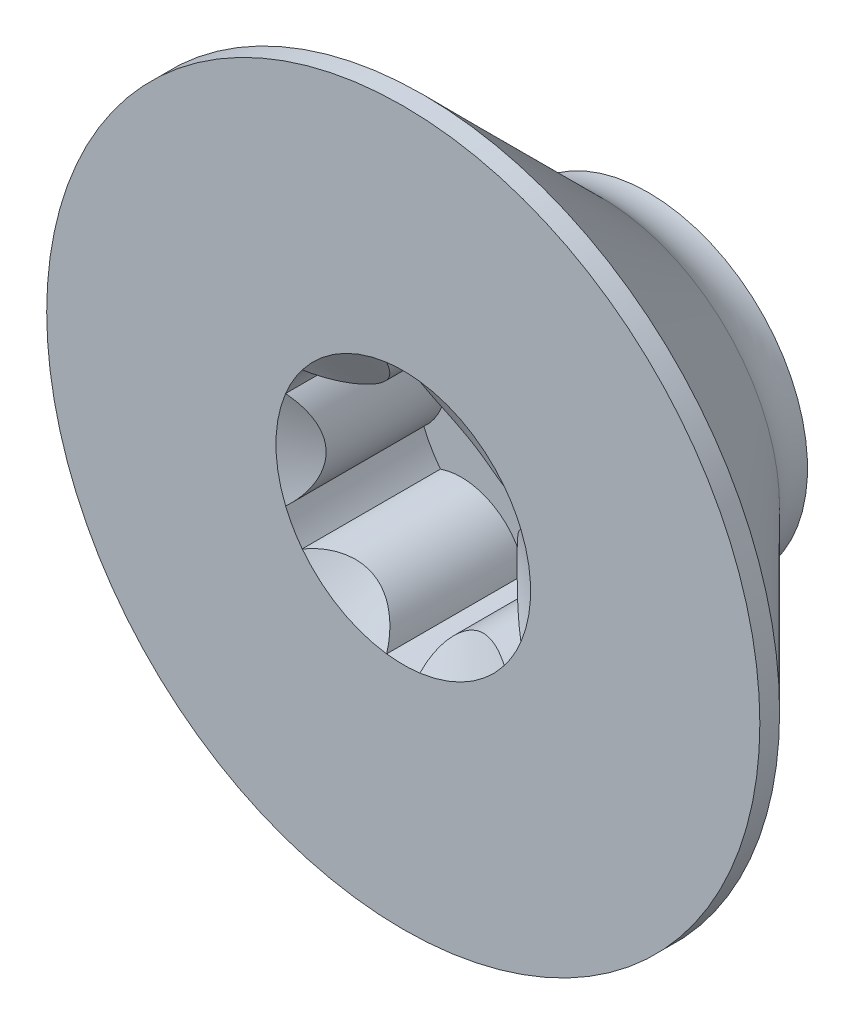
ISO-10303-21;
HEADER;
FILE_DESCRIPTION(('STEP AP214'),'2;1');
FILE_NAME('part.step','',(''),(''),'','','');
FILE_SCHEMA(('AUTOMOTIVE_DESIGN { 1 0 10303 214 1 1 1 1 }'));
ENDSEC;
DATA;
#1=APPLICATION_CONTEXT('core data for automotive mechanical design processes');
#2=APPLICATION_PROTOCOL_DEFINITION('international standard','automotive_design',2000,#1);
#3=PRODUCT_CONTEXT('',#1,'mechanical');
#4=PRODUCT('Part','Part','',(#3));
#5=PRODUCT_RELATED_PRODUCT_CATEGORY('part','',(#4));
#6=PRODUCT_DEFINITION_FORMATION('','',#4);
#7=PRODUCT_DEFINITION_CONTEXT('part definition',#1,'design');
#8=PRODUCT_DEFINITION('design','',#6,#7);
#9=PRODUCT_DEFINITION_SHAPE('','',#8);
#10=(LENGTH_UNIT() NAMED_UNIT(*) SI_UNIT(.MILLI.,.METRE.));
#11=(NAMED_UNIT(*) PLANE_ANGLE_UNIT() SI_UNIT($,.RADIAN.));
#12=(NAMED_UNIT(*) SI_UNIT($,.STERADIAN.) SOLID_ANGLE_UNIT());
#13=UNCERTAINTY_MEASURE_WITH_UNIT(LENGTH_MEASURE(1.E-05),#10,'distance_accuracy_value','');
#14=(GEOMETRIC_REPRESENTATION_CONTEXT(3) GLOBAL_UNCERTAINTY_ASSIGNED_CONTEXT((#13)) GLOBAL_UNIT_ASSIGNED_CONTEXT((#10,
#11,#12)) REPRESENTATION_CONTEXT('',''));
#15=CARTESIAN_POINT('',(0.,0.,0.));
#16=DIRECTION('',(0.,0.,1.));
#17=DIRECTION('',(1.,0.,0.));
#18=AXIS2_PLACEMENT_3D('',#15,#16,#17);
#19=CARTESIAN_POINT('',(0.,0.,-5.6843418860808E-11));
#20=DIRECTION('',(0.,0.,1.));
#21=DIRECTION('',(1.,0.,0.));
#22=AXIS2_PLACEMENT_3D('',#19,#20,#21);
#23=CONICAL_SURFACE('',#22,1.99999999989586,1.0471975512089);
#24=CARTESIAN_POINT('',(-1.84775906502267,0.765366864730291,3.35881149449636E-12));
#25=CARTESIAN_POINT('',(-1.82679674641308,0.747056027473375,-0.0152238683224688));
#26=CARTESIAN_POINT('',(-1.80651528336189,0.727831960891158,-0.0302588823249752));
#27=CARTESIAN_POINT('',(-1.76740513351053,0.687540802662732,-0.0598189343843815));
#28=CARTESIAN_POINT('',(-1.74857824004046,0.666471502192737,-0.0743433312559914));
#29=CARTESIAN_POINT('',(-1.69418339623,0.600166604567393,-0.117138232672408));
#30=CARTESIAN_POINT('',(-1.66106296120929,0.552146254879396,-0.144365576121972));
#31=CARTESIAN_POINT('',(-1.6090468471527,0.460298780203178,-0.188626206330927));
#32=CARTESIAN_POINT('',(-1.58862383693925,0.41778220122538,-0.206593330210003));
#33=CARTESIAN_POINT('',(-1.55356856955068,0.329020197426314,-0.238128431972136));
#34=CARTESIAN_POINT('',(-1.53891426005207,0.282789802535261,-0.251713126116636));
#35=CARTESIAN_POINT('',(-1.51800768029137,0.194886276103911,-0.271360848688806));
#36=CARTESIAN_POINT('',(-1.51079927575463,0.153632562684492,-0.278268411323695));
#37=CARTESIAN_POINT('',(-1.50154462512118,0.070015972232407,-0.287168365717986));
#38=CARTESIAN_POINT('',(-1.49949648381577,0.027653508187644,-0.289162562002376));
#39=CARTESIAN_POINT('',(-1.50071460979296,-0.0569440107304732,-0.287983285466117));
#40=CARTESIAN_POINT('',(-1.50398395531869,-0.0991789776152245,-0.284806819396777));
#41=CARTESIAN_POINT('',(-1.51560246229933,-0.182288930425316,-0.273677706531455));
#42=CARTESIAN_POINT('',(-1.52395466268178,-0.223163087320971,-0.265722202490104));
#43=CARTESIAN_POINT('',(-1.54780627502721,-0.312201623236177,-0.243470771410179));
#44=CARTESIAN_POINT('',(-1.56453858574171,-0.359766576056661,-0.228112461167358));
#45=CARTESIAN_POINT('',(-1.60405661038,-0.450678167653208,-0.193007553579758));
#46=CARTESIAN_POINT('',(-1.62686341488875,-0.494009376342824,-0.173245707024587));
#47=CARTESIAN_POINT('',(-1.67962174633487,-0.579196712824482,-0.129117003203694));
#48=CARTESIAN_POINT('',(-1.70999546714635,-0.620665648629647,-0.104509642724714));
#49=CARTESIAN_POINT('',(-1.75918337244193,-0.678361341469527,-0.0661604495560057));
#50=CARTESIAN_POINT('',(-1.7761075592942,-0.696775868251633,-0.053193487779679));
#51=CARTESIAN_POINT('',(-1.81109638947949,-0.732156016067272,-0.026866991625521));
#52=CARTESIAN_POINT('',(-1.82916025928735,-0.749122601832335,-0.0135077267344029));
#53=CARTESIAN_POINT('',(-1.84775906502267,-0.765366864730291,3.35843881634344E-12));
#54=B_SPLINE_CURVE_WITH_KNOTS('',3,(#24,#25,#26,#27,#28,#29,#30,#31,#32,#33,#34,#35,#36,#37,#38,
#39,#40,#41,#42,#43,#44,#45,#46,#47,#48,#49,#50,#51,#52,#53),.UNSPECIFIED.,.F.,.F.,(4,2,2,2,2,2,
2,2,2,2,2,2,2,2,4),(0.,0.0951229900385469,0.190361444756559,0.382460595296424,0.53334787054542,
0.683652605425383,0.810429442598182,0.937159711679269,1.06396336983624,1.19084291570532,
1.34811922291334,1.50594887578386,1.6762514428505,1.76071621820737,1.84512426985371),.UNSPECIFIED.);
#55=CARTESIAN_POINT('',(-1.84775906502636,0.765366864733511,4.39685374961005E-12));
#56=VERTEX_POINT('',#55);
#57=CARTESIAN_POINT('',(-1.84775906502636,-0.765366864733509,4.39685374961005E-12));
#58=VERTEX_POINT('',#57);
#59=EDGE_CURVE('E129',#56,#58,#54,.T.);
#60=ORIENTED_EDGE('',*,*,#59,.F.);
#61=CARTESIAN_POINT('',(0.,0.,8.7937074992201E-12));
#62=DIRECTION('',(0.,0.,1.));
#63=DIRECTION('',(1.,0.,0.));
#64=AXIS2_PLACEMENT_3D('',#61,#62,#63);
#65=CIRCLE('',#64,2.00000000000955);
#66=EDGE_CURVE('E20',#58,#56,#65,.F.);
#67=ORIENTED_EDGE('',*,*,#66,.F.);
#68=EDGE_LOOP('',(#60,#67));
#69=FACE_BOUND('',#68,.T.);
#70=ADVANCED_FACE('F16',(#69),#23,.F.);
#71=CARTESIAN_POINT('',(0.,0.,-5.6843418860808E-11));
#72=DIRECTION('',(0.,0.,1.));
#73=DIRECTION('',(1.,0.,0.));
#74=AXIS2_PLACEMENT_3D('',#71,#72,#73);
#75=CONICAL_SURFACE('',#74,1.99999999989586,1.0471975512089);
#76=CARTESIAN_POINT('',(-0.261052384440077,1.98288972274776,3.35771034073655E-12));
#77=CARTESIAN_POINT('',(-0.266428875364333,1.95558040368117,-0.0152238683224701));
#78=CARTESIAN_POINT('',(-0.272936673862979,1.92840410816181,-0.0302588823249764));
#79=CARTESIAN_POINT('',(-0.288274765511015,1.87438814573051,-0.0598189343843826));
#80=CARTESIAN_POINT('',(-0.297107868222961,1.84754892747608,-0.0743433312559924));
#81=CARTESIAN_POINT('',(-0.327332172056604,1.76728916208867,-0.117138232672409));
#82=CARTESIAN_POINT('',(-0.352358797274669,1.71459584913235,-0.144365576121973));
#83=CARTESIAN_POINT('',(-0.405892986589424,1.62362483561508,-0.188626206330928));
#84=CARTESIAN_POINT('',(-0.432501918959478,1.58467970045958,-0.206593330210004));
#85=CARTESIAN_POINT('',(-0.491844435445998,1.50993994646509,-0.238128431972137));
#86=CARTESIAN_POINT('',(-0.524553977099328,1.47413374471885,-0.251713126116637));
#87=CARTESIAN_POINT('',(-0.590227374190765,1.41207635232416,-0.271360848688806));
#88=CARTESIAN_POINT('',(-0.622349935744055,1.38520683416488,-0.278268411323696));
#89=CARTESIAN_POINT('',(-0.690136701936673,1.33538377638712,-0.287168365717987));
#90=CARTESIAN_POINT('',(-0.725799601313637,1.31242880196371,-0.289162562002376));
#91=CARTESIAN_POINT('',(-0.799672264782456,1.27118497054591,-0.287983285466118));
#92=CARTESIAN_POINT('',(-0.837883491795509,1.25289882338256,-0.284806819396778));
#93=CARTESIAN_POINT('',(-0.915668075726695,1.2214057691768,-0.273677706531455));
#94=CARTESIAN_POINT('',(-0.955242234147826,1.20820190843767,-0.265722202490105));
#95=CARTESIAN_POINT('',(-1.04427767433889,1.18433874269243,-0.24347077141018));
#96=CARTESIAN_POINT('',(-1.09383628716848,1.17504687242496,-0.228112461167358));
#97=CARTESIAN_POINT('',(-1.19232704730871,1.16381468987083,-0.193007553579758));
#98=CARTESIAN_POINT('',(-1.24125637706498,1.16190035760973,-0.173245707024587));
#99=CARTESIAN_POINT('',(-1.34140994026189,1.16499674466252,-0.129117003203695));
#100=CARTESIAN_POINT('',(-1.3925099525428,1.17056669059014,-0.104509642724715));
#101=CARTESIAN_POINT('',(-1.46706984087887,1.18431681971511,-0.0661604495560069));
#102=CARTESIAN_POINT('',(-1.49147938229698,1.18976633207652,-0.0531934877796802));
#103=CARTESIAN_POINT('',(-1.53961390418762,1.20237747395786,-0.0268669916255223));
#104=CARTESIAN_POINT('',(-1.56333933337958,1.20953795121959,-0.0135077267344044));
#105=CARTESIAN_POINT('',(-1.58670668058263,1.21752285801746,3.35688077097752E-12));
#106=B_SPLINE_CURVE_WITH_KNOTS('',3,(#76,#77,#78,#79,#80,#81,#82,#83,#84,#85,#86,#87,#88,#89,
#90,#91,#92,#93,#94,#95,#96,#97,#98,#99,#100,#101,#102,#103,#104,#105),.UNSPECIFIED.,.F.,.F.,(4,
2,2,2,2,2,2,2,2,2,2,2,2,2,4),(0.,0.0951229900385467,0.190361444756558,0.382460595296423,
0.533347870545419,0.683652605425383,0.810429442598181,0.937159711679268,1.06396336983623,
1.19084291570532,1.34811922291333,1.50594887578386,1.67625144285049,1.76071621820737,
1.84512426985371),.UNSPECIFIED.);
#107=CARTESIAN_POINT('',(-0.261052384439132,1.98288972275256,4.39672855672683E-12));
#108=VERTEX_POINT('',#107);
#109=CARTESIAN_POINT('',(-1.58670668058726,1.21752285801904,4.39672855672683E-12));
#110=VERTEX_POINT('',#109);
#111=EDGE_CURVE('E244',#108,#110,#106,.T.);
#112=ORIENTED_EDGE('',*,*,#111,.F.);
#113=CARTESIAN_POINT('',(0.,0.,8.79345711345365E-12));
#114=DIRECTION('',(0.,0.,1.));
#115=DIRECTION('',(1.,0.,0.));
#116=AXIS2_PLACEMENT_3D('',#113,#114,#115);
#117=CIRCLE('',#116,2.00000000000955);
#118=EDGE_CURVE('E114',#110,#108,#117,.F.);
#119=ORIENTED_EDGE('',*,*,#118,.F.);
#120=EDGE_LOOP('',(#112,#119));
#121=FACE_BOUND('',#120,.T.);
#122=ADVANCED_FACE('F289',(#121),#75,.F.);
#123=CARTESIAN_POINT('',(0.,0.,-2.17));
#124=DIRECTION('',(0.,0.,1.));
#125=DIRECTION('',(1.,0.,0.));
#126=AXIS2_PLACEMENT_3D('',#123,#124,#125);
#127=CYLINDRICAL_SURFACE('',#126,2.);
#128=DIRECTION('',(0.,0.,1.));
#129=VECTOR('',#128,1.);
#130=CARTESIAN_POINT('',(-1.84775906502257,0.765366864730198,-2.17));
#131=LINE('',#130,#129);
#132=CARTESIAN_POINT('',(-1.84775906502257,0.765366864730197,-2.17));
#133=VERTEX_POINT('',#132);
#134=EDGE_CURVE('E120',#133,#56,#131,.T.);
#135=ORIENTED_EDGE('',*,*,#134,.F.);
#136=CARTESIAN_POINT('',(0.,0.,-2.17));
#137=DIRECTION('',(0.,0.,1.));
#138=DIRECTION('',(1.,0.,0.));
#139=AXIS2_PLACEMENT_3D('',#136,#137,#138);
#140=CIRCLE('',#139,2.);
#141=CARTESIAN_POINT('',(-1.58670668058249,1.21752285801741,-2.17));
#142=VERTEX_POINT('',#141);
#143=EDGE_CURVE('E126',#142,#133,#140,.T.);
#144=ORIENTED_EDGE('',*,*,#143,.F.);
#145=DIRECTION('',(0.,0.,1.));
#146=VECTOR('',#145,1.);
#147=CARTESIAN_POINT('',(-1.58670668058249,1.21752285801741,-2.17));
#148=LINE('',#147,#146);
#149=EDGE_CURVE('E123',#110,#142,#148,.F.);
#150=ORIENTED_EDGE('',*,*,#149,.F.);
#151=CARTESIAN_POINT('',(0.,0.,0.));
#152=DIRECTION('',(0.,0.,1.));
#153=DIRECTION('',(1.,0.,0.));
#154=AXIS2_PLACEMENT_3D('',#151,#152,#153);
#155=CIRCLE('',#154,2.);
#156=EDGE_CURVE('E109',#56,#110,#155,.F.);
#157=ORIENTED_EDGE('',*,*,#156,.F.);
#158=EDGE_LOOP('',(#135,#144,#150,#157));
#159=FACE_BOUND('',#158,.T.);
#160=ADVANCED_FACE('F118',(#159),#127,.F.);
#161=CARTESIAN_POINT('',(0.,0.,-2.17));
#162=DIRECTION('',(0.,0.,1.));
#163=DIRECTION('',(1.,0.,0.));
#164=AXIS2_PLACEMENT_3D('',#161,#162,#163);
#165=CYLINDRICAL_SURFACE('',#164,2.);
#166=DIRECTION('',(0.,0.,1.));
#167=VECTOR('',#166,1.);
#168=CARTESIAN_POINT('',(-1.58670668058248,-1.21752285801743,-2.17));
#169=LINE('',#168,#167);
#170=CARTESIAN_POINT('',(-1.58670668058248,-1.21752285801743,-2.17));
#171=VERTEX_POINT('',#170);
#172=CARTESIAN_POINT('',(-1.58670668058725,-1.21752285801906,4.39685374961005E-12));
#173=VERTEX_POINT('',#172);
#174=EDGE_CURVE('E243',#171,#173,#169,.T.);
#175=ORIENTED_EDGE('',*,*,#174,.F.);
#176=CARTESIAN_POINT('',(0.,0.,-2.17));
#177=DIRECTION('',(0.,0.,1.));
#178=DIRECTION('',(1.,0.,0.));
#179=AXIS2_PLACEMENT_3D('',#176,#177,#178);
#180=CIRCLE('',#179,2.);
#181=CARTESIAN_POINT('',(-1.84775906502257,-0.765366864730197,-2.17));
#182=VERTEX_POINT('',#181);
#183=EDGE_CURVE('E125',#182,#171,#180,.T.);
#184=ORIENTED_EDGE('',*,*,#183,.F.);
#185=DIRECTION('',(0.,0.,1.));
#186=VECTOR('',#185,1.);
#187=CARTESIAN_POINT('',(-1.84775906502257,-0.765366864730197,-2.17));
#188=LINE('',#187,#186);
#189=EDGE_CURVE('E132',#58,#182,#188,.F.);
#190=ORIENTED_EDGE('',*,*,#189,.F.);
#191=CARTESIAN_POINT('',(0.,0.,0.));
#192=DIRECTION('',(0.,0.,1.));
#193=DIRECTION('',(1.,0.,0.));
#194=AXIS2_PLACEMENT_3D('',#191,#192,#193);
#195=CIRCLE('',#194,2.);
#196=EDGE_CURVE('E103',#173,#58,#195,.F.);
#197=ORIENTED_EDGE('',*,*,#196,.F.);
#198=EDGE_LOOP('',(#175,#184,#190,#197));
#199=FACE_BOUND('',#198,.T.);
#200=ADVANCED_FACE('F232',(#199),#165,.F.);
#201=CARTESIAN_POINT('',(0.,0.,-5.6843418860808E-11));
#202=DIRECTION('',(0.,0.,1.));
#203=DIRECTION('',(1.,0.,0.));
#204=AXIS2_PLACEMENT_3D('',#201,#202,#203);
#205=CONICAL_SURFACE('',#204,1.99999999989586,1.0471975512089);
#206=CARTESIAN_POINT('',(-1.58670668058262,-1.21752285801747,3.35805564192654E-12));
#207=CARTESIAN_POINT('',(-1.56036787104877,-1.2085243762078,-0.0152238683224697));
#208=CARTESIAN_POINT('',(-1.53357860949893,-1.20057214727066,-0.0302588823249763));
#209=CARTESIAN_POINT('',(-1.47913036799953,-1.18684734306778,-0.0598189343843828));
#210=CARTESIAN_POINT('',(-1.45147037181751,-1.18107742528335,-0.0743433312559929));
#211=CARTESIAN_POINT('',(-1.36685122417341,-1.16712255752127,-0.11713823267241));
#212=CARTESIAN_POINT('',(-1.30870416393464,-1.16244959425295,-0.144365576121974));
#213=CARTESIAN_POINT('',(-1.20315386056329,-1.1633260554119,-0.18862620633093));
#214=CARTESIAN_POINT('',(-1.15612191797978,-1.1668974992342,-0.206593330210007));
#215=CARTESIAN_POINT('',(-1.0617241341047,-1.18091974903878,-0.23812843197214));
#216=CARTESIAN_POINT('',(-1.01436028295275,-1.19134394218359,-0.25171312611664));
#217=CARTESIAN_POINT('',(-0.927780306100617,-1.21719007622025,-0.27136084868881));
#218=CARTESIAN_POINT('',(-0.888449340010588,-1.23157427148039,-0.2782684113237));
#219=CARTESIAN_POINT('',(-0.811407923184515,-1.26536780415471,-0.287168365717992));
#220=CARTESIAN_POINT('',(-0.773696882502141,-1.28477529377607,-0.289162562002381));
#221=CARTESIAN_POINT('',(-0.701042345010512,-1.32812898127638,-0.287983285466123));
#222=CARTESIAN_POINT('',(-0.666100463523186,-1.35207780099779,-0.284806819396783));
#223=CARTESIAN_POINT('',(-0.599934386572642,-1.40369469960212,-0.273677706531461));
#224=CARTESIAN_POINT('',(-0.568712428533957,-1.43136499575864,-0.26572220249011));
#225=CARTESIAN_POINT('',(-0.503528600688334,-1.49654036592861,-0.243470771410186));
#226=CARTESIAN_POINT('',(-0.470702298573236,-1.53481344848162,-0.228112461167364));
#227=CARTESIAN_POINT('',(-0.411729563071295,-1.61449285752403,-0.193007553579765));
#228=CARTESIAN_POINT('',(-0.385607037823774,-1.65590973395256,-0.173245707024594));
#229=CARTESIAN_POINT('',(-0.338211806072985,-1.74419345748701,-0.129117003203701));
#230=CARTESIAN_POINT('',(-0.317485514603543,-1.79123233921979,-0.10450964272472));
#231=CARTESIAN_POINT('',(-0.292113531563052,-1.86267816118465,-0.0661604495560105));
#232=CARTESIAN_POINT('',(-0.284628176997214,-1.88654220032816,-0.0531934877796834));
#233=CARTESIAN_POINT('',(-0.271482485291868,-1.93453349002514,-0.0268669916255245));
#234=CARTESIAN_POINT('',(-0.265820925907766,-1.95866055305194,-0.013507726734406));
#235=CARTESIAN_POINT('',(-0.261052384440046,-1.98288972274776,3.35607342125053E-12));
#236=B_SPLINE_CURVE_WITH_KNOTS('',3,(#206,#207,#208,#209,#210,#211,#212,#213,#214,#215,#216,
#217,#218,#219,#220,#221,#222,#223,#224,#225,#226,#227,#228,#229,#230,#231,#232,#233,#234,#235),
.UNSPECIFIED.,.F.,.F.,(4,2,2,2,2,2,2,2,2,2,2,2,2,2,4),(0.,0.0951229900385474,0.19036144475656,
0.382460595296426,0.533347870545423,0.683652605425387,0.810429442598186,0.937159711679273,
1.06396336983624,1.19084291570532,1.34811922291334,1.50594887578386,1.6762514428505,
1.76071621820738,1.84512426985373),.UNSPECIFIED.);
#237=CARTESIAN_POINT('',(-0.2610523844391,-1.98288972275257,4.39707059004455E-12));
#238=VERTEX_POINT('',#237);
#239=EDGE_CURVE('E235',#173,#238,#236,.T.);
#240=ORIENTED_EDGE('',*,*,#239,.F.);
#241=CARTESIAN_POINT('',(0.,0.,8.7937074992201E-12));
#242=DIRECTION('',(0.,0.,1.));
#243=DIRECTION('',(1.,0.,0.));
#244=AXIS2_PLACEMENT_3D('',#241,#242,#243);
#245=CIRCLE('',#244,2.00000000000955);
#246=EDGE_CURVE('E274',#238,#173,#245,.F.);
#247=ORIENTED_EDGE('',*,*,#246,.F.);
#248=EDGE_LOOP('',(#240,#247));
#249=FACE_BOUND('',#248,.T.);
#250=ADVANCED_FACE('F227',(#249),#205,.F.);
#251=CARTESIAN_POINT('',(0.,0.,-2.17));
#252=DIRECTION('',(0.,0.,1.));
#253=DIRECTION('',(1.,0.,0.));
#254=AXIS2_PLACEMENT_3D('',#251,#252,#253);
#255=CYLINDRICAL_SURFACE('',#254,2.);
#256=DIRECTION('',(0.,0.,1.));
#257=VECTOR('',#256,1.);
#258=CARTESIAN_POINT('',(0.261052384440095,-1.98288972274762,-2.17));
#259=LINE('',#258,#257);
#260=CARTESIAN_POINT('',(0.261052384440095,-1.98288972274762,-2.17));
#261=VERTEX_POINT('',#260);
#262=CARTESIAN_POINT('',(0.261052384439124,-1.98288972275256,4.39685374961005E-12));
#263=VERTEX_POINT('',#262);
#264=EDGE_CURVE('E298',#261,#263,#259,.T.);
#265=ORIENTED_EDGE('',*,*,#264,.F.);
#266=CARTESIAN_POINT('',(0.,0.,-2.17));
#267=DIRECTION('',(0.,0.,1.));
#268=DIRECTION('',(1.,0.,0.));
#269=AXIS2_PLACEMENT_3D('',#266,#267,#268);
#270=CIRCLE('',#269,2.);
#271=CARTESIAN_POINT('',(-0.261052384440075,-1.98288972274762,-2.17));
#272=VERTEX_POINT('',#271);
#273=EDGE_CURVE('E272',#272,#261,#270,.T.);
#274=ORIENTED_EDGE('',*,*,#273,.F.);
#275=DIRECTION('',(0.,0.,1.));
#276=VECTOR('',#275,1.);
#277=CARTESIAN_POINT('',(-0.261052384440075,-1.98288972274762,-2.17));
#278=LINE('',#277,#276);
#279=EDGE_CURVE('E242',#238,#272,#278,.F.);
#280=ORIENTED_EDGE('',*,*,#279,.F.);
#281=CARTESIAN_POINT('',(0.,0.,0.));
#282=DIRECTION('',(0.,0.,1.));
#283=DIRECTION('',(1.,0.,0.));
#284=AXIS2_PLACEMENT_3D('',#281,#282,#283);
#285=CIRCLE('',#284,2.);
#286=EDGE_CURVE('E270',#263,#238,#285,.F.);
#287=ORIENTED_EDGE('',*,*,#286,.F.);
#288=EDGE_LOOP('',(#265,#274,#280,#287));
#289=FACE_BOUND('',#288,.T.);
#290=ADVANCED_FACE('F223',(#289),#255,.F.);
#291=CARTESIAN_POINT('',(0.,0.,-5.6843418860808E-11));
#292=DIRECTION('',(0.,0.,1.));
#293=DIRECTION('',(1.,0.,0.));
#294=AXIS2_PLACEMENT_3D('',#291,#292,#293);
#295=CONICAL_SURFACE('',#294,1.99999999989586,1.0471975512089);
#296=CARTESIAN_POINT('',(0.261052384440068,-1.98288972274776,3.35792293664207E-12));
#297=CARTESIAN_POINT('',(0.266428875364324,-1.95558040368117,-0.0152238683224698));
#298=CARTESIAN_POINT('',(0.27293667386297,-1.92840410816181,-0.0302588823249762));
#299=CARTESIAN_POINT('',(0.288274765511007,-1.87438814573051,-0.0598189343843825));
#300=CARTESIAN_POINT('',(0.297107868222953,-1.84754892747609,-0.0743433312559922));
#301=CARTESIAN_POINT('',(0.327332172056596,-1.76728916208867,-0.117138232672409));
#302=CARTESIAN_POINT('',(0.352358797274662,-1.71459584913235,-0.144365576121973));
#303=CARTESIAN_POINT('',(0.405892986589417,-1.62362483561508,-0.188626206330928));
#304=CARTESIAN_POINT('',(0.432501918959472,-1.58467970045958,-0.206593330210004));
#305=CARTESIAN_POINT('',(0.491844435445992,-1.5099399464651,-0.238128431972136));
#306=CARTESIAN_POINT('',(0.524553977099322,-1.47413374471885,-0.251713126116636));
#307=CARTESIAN_POINT('',(0.590227374190759,-1.41207635232417,-0.271360848688806));
#308=CARTESIAN_POINT('',(0.62234993574405,-1.38520683416489,-0.278268411323695));
#309=CARTESIAN_POINT('',(0.690136701936668,-1.33538377638712,-0.287168365717986));
#310=CARTESIAN_POINT('',(0.725799601313633,-1.31242880196372,-0.289162562002376));
#311=CARTESIAN_POINT('',(0.799672264782452,-1.27118497054591,-0.287983285466117));
#312=CARTESIAN_POINT('',(0.837883491795504,-1.25289882338257,-0.284806819396777));
#313=CARTESIAN_POINT('',(0.915668075726692,-1.22140576917681,-0.273677706531454));
#314=CARTESIAN_POINT('',(0.955242234147823,-1.20820190843767,-0.265722202490103));
#315=CARTESIAN_POINT('',(1.04427767433888,-1.18433874269244,-0.243470771410178));
#316=CARTESIAN_POINT('',(1.09383628716848,-1.17504687242497,-0.228112461167357));
#317=CARTESIAN_POINT('',(1.19232704730871,-1.16381468987083,-0.193007553579757));
#318=CARTESIAN_POINT('',(1.24125637706498,-1.16190035760974,-0.173245707024585));
#319=CARTESIAN_POINT('',(1.34140994026189,-1.16499674466253,-0.129117003203693));
#320=CARTESIAN_POINT('',(1.3925099525428,-1.17056669059015,-0.104509642724713));
#321=CARTESIAN_POINT('',(1.46706984087887,-1.18431681971512,-0.0661604495560047));
#322=CARTESIAN_POINT('',(1.49147938229698,-1.18976633207653,-0.0531934877796782));
#323=CARTESIAN_POINT('',(1.53961390418762,-1.20237747395787,-0.0268669916255204));
#324=CARTESIAN_POINT('',(1.56333933337958,-1.2095379512196,-0.0135077267344025));
#325=CARTESIAN_POINT('',(1.58670668058262,-1.21752285801747,3.35892767897091E-12));
#326=B_SPLINE_CURVE_WITH_KNOTS('',3,(#296,#297,#298,#299,#300,#301,#302,#303,#304,#305,#306,
#307,#308,#309,#310,#311,#312,#313,#314,#315,#316,#317,#318,#319,#320,#321,#322,#323,#324,#325),
.UNSPECIFIED.,.F.,.F.,(4,2,2,2,2,2,2,2,2,2,2,2,2,2,4),(0.,0.0951229900385467,0.190361444756558,
0.382460595296423,0.533347870545419,0.683652605425382,0.810429442598181,0.937159711679268,
1.06396336983623,1.19084291570532,1.34811922291334,1.50594887578386,1.67625144285049,
1.76071621820737,1.84512426985371),.UNSPECIFIED.);
#327=CARTESIAN_POINT('',(1.58670668058726,-1.21752285801905,4.39728743047904E-12));
#328=VERTEX_POINT('',#327);
#329=EDGE_CURVE('E204',#263,#328,#326,.T.);
#330=ORIENTED_EDGE('',*,*,#329,.F.);
#331=CARTESIAN_POINT('',(0.,0.,8.7937074992201E-12));
#332=DIRECTION('',(0.,0.,1.));
#333=DIRECTION('',(1.,0.,0.));
#334=AXIS2_PLACEMENT_3D('',#331,#332,#333);
#335=CIRCLE('',#334,2.00000000000955);
#336=EDGE_CURVE('E268',#328,#263,#335,.F.);
#337=ORIENTED_EDGE('',*,*,#336,.F.);
#338=EDGE_LOOP('',(#330,#337));
#339=FACE_BOUND('',#338,.T.);
#340=ADVANCED_FACE('F217',(#339),#295,.F.);
#341=CARTESIAN_POINT('',(0.,0.,-5.6843418860808E-11));
#342=DIRECTION('',(0.,0.,1.));
#343=DIRECTION('',(1.,0.,0.));
#344=AXIS2_PLACEMENT_3D('',#341,#342,#343);
#345=CONICAL_SURFACE('',#344,1.99999999989586,1.0471975512089);
#346=CARTESIAN_POINT('',(1.58670668058261,1.21752285801749,3.35786465807354E-12));
#347=CARTESIAN_POINT('',(1.56036787104876,1.20852437620781,-0.0152238683224699));
#348=CARTESIAN_POINT('',(1.53357860949892,1.20057214727067,-0.0302588823249764));
#349=CARTESIAN_POINT('',(1.47913036799952,1.18684734306779,-0.0598189343843827));
#350=CARTESIAN_POINT('',(1.4514703718175,1.18107742528336,-0.0743433312559925));
#351=CARTESIAN_POINT('',(1.3668512241734,1.16712255752129,-0.117138232672409));
#352=CARTESIAN_POINT('',(1.30870416393463,1.16244959425296,-0.144365576121974));
#353=CARTESIAN_POINT('',(1.20315386056328,1.16332605541191,-0.188626206330929));
#354=CARTESIAN_POINT('',(1.15612191797977,1.16689749923421,-0.206593330210005));
#355=CARTESIAN_POINT('',(1.06172413410469,1.18091974903879,-0.238128431972137));
#356=CARTESIAN_POINT('',(1.01436028295274,1.1913439421836,-0.251713126116637));
#357=CARTESIAN_POINT('',(0.927780306100609,1.21719007622026,-0.271360848688808));
#358=CARTESIAN_POINT('',(0.88844934001058,1.2315742714804,-0.278268411323697));
#359=CARTESIAN_POINT('',(0.811407923184508,1.26536780415472,-0.287168365717989));
#360=CARTESIAN_POINT('',(0.773696882502134,1.28477529377608,-0.289162562002378));
#361=CARTESIAN_POINT('',(0.701042345010504,1.32812898127639,-0.287983285466119));
#362=CARTESIAN_POINT('',(0.666100463523178,1.3520778009978,-0.28480681939678));
#363=CARTESIAN_POINT('',(0.599934386572635,1.40369469960213,-0.273677706531457));
#364=CARTESIAN_POINT('',(0.568712428533949,1.43136499575865,-0.265722202490106));
#365=CARTESIAN_POINT('',(0.503528600688326,1.49654036592862,-0.243470771410181));
#366=CARTESIAN_POINT('',(0.470702298573228,1.53481344848163,-0.22811246116736));
#367=CARTESIAN_POINT('',(0.411729563071287,1.61449285752404,-0.19300755357976));
#368=CARTESIAN_POINT('',(0.385607037823766,1.65590973395257,-0.173245707024589));
#369=CARTESIAN_POINT('',(0.338211806072977,1.74419345748702,-0.129117003203697));
#370=CARTESIAN_POINT('',(0.317485514603535,1.7912323392198,-0.104509642724716));
#371=CARTESIAN_POINT('',(0.292113531563043,1.86267816118465,-0.0661604495560067));
#372=CARTESIAN_POINT('',(0.284628176997205,1.88654220032817,-0.0531934877796798));
#373=CARTESIAN_POINT('',(0.271482485291859,1.93453349002515,-0.0268669916255211));
#374=CARTESIAN_POINT('',(0.265820925907757,1.95866055305195,-0.0135077267344027));
#375=CARTESIAN_POINT('',(0.261052384440037,1.98288972274777,3.35918573195499E-12));
#376=B_SPLINE_CURVE_WITH_KNOTS('',3,(#346,#347,#348,#349,#350,#351,#352,#353,#354,#355,#356,
#357,#358,#359,#360,#361,#362,#363,#364,#365,#366,#367,#368,#369,#370,#371,#372,#373,#374,#375),
.UNSPECIFIED.,.F.,.F.,(4,2,2,2,2,2,2,2,2,2,2,2,2,2,4),(0.,0.0951229900385469,0.190361444756559,
0.382460595296424,0.53334787054542,0.683652605425383,0.810429442598182,0.937159711679269,
1.06396336983624,1.19084291570532,1.34811922291334,1.50594887578386,1.6762514428505,
1.76071621820738,1.84512426985372),.UNSPECIFIED.);
#377=CARTESIAN_POINT('',(1.58670668058724,1.21752285801907,4.39685374961005E-12));
#378=VERTEX_POINT('',#377);
#379=CARTESIAN_POINT('',(0.261052384439093,1.98288972275257,4.39706626189703E-12));
#380=VERTEX_POINT('',#379);
#381=EDGE_CURVE('E194',#378,#380,#376,.T.);
#382=ORIENTED_EDGE('',*,*,#381,.F.);
#383=CARTESIAN_POINT('',(0.,0.,8.7937074992201E-12));
#384=DIRECTION('',(0.,0.,1.));
#385=DIRECTION('',(1.,0.,0.));
#386=AXIS2_PLACEMENT_3D('',#383,#384,#385);
#387=CIRCLE('',#386,2.00000000000955);
#388=EDGE_CURVE('E266',#380,#378,#387,.F.);
#389=ORIENTED_EDGE('',*,*,#388,.F.);
#390=EDGE_LOOP('',(#382,#389));
#391=FACE_BOUND('',#390,.T.);
#392=ADVANCED_FACE('F212',(#391),#345,.F.);
#393=CARTESIAN_POINT('',(0.,0.,-2.17));
#394=DIRECTION('',(0.,0.,1.));
#395=DIRECTION('',(0.,-1.,0.));
#396=AXIS2_PLACEMENT_3D('',#393,#394,#395);
#397=CYLINDRICAL_SURFACE('',#396,2.);
#398=DIRECTION('',(0.,0.,1.));
#399=VECTOR('',#398,1.);
#400=CARTESIAN_POINT('',(-0.261052384440103,1.98288972274762,-2.17));
#401=LINE('',#400,#399);
#402=CARTESIAN_POINT('',(-0.261052384440103,1.98288972274762,-2.17));
#403=VERTEX_POINT('',#402);
#404=EDGE_CURVE('E286',#403,#108,#401,.T.);
#405=ORIENTED_EDGE('',*,*,#404,.F.);
#406=CARTESIAN_POINT('',(0.,0.,-2.17));
#407=DIRECTION('',(0.,0.,1.));
#408=DIRECTION('',(0.,-1.,0.));
#409=AXIS2_PLACEMENT_3D('',#406,#407,#408);
#410=CIRCLE('',#409,2.);
#411=CARTESIAN_POINT('',(0.261052384440066,1.98288972274762,-2.17));
#412=VERTEX_POINT('',#411);
#413=EDGE_CURVE('E139',#412,#403,#410,.T.);
#414=ORIENTED_EDGE('',*,*,#413,.F.);
#415=DIRECTION('',(0.,0.,1.));
#416=VECTOR('',#415,1.);
#417=CARTESIAN_POINT('',(0.261052384440066,1.98288972274763,-2.17));
#418=LINE('',#417,#416);
#419=EDGE_CURVE('E203',#380,#412,#418,.F.);
#420=ORIENTED_EDGE('',*,*,#419,.F.);
#421=CARTESIAN_POINT('',(0.,0.,0.));
#422=DIRECTION('',(0.,0.,1.));
#423=DIRECTION('',(0.,-1.,0.));
#424=AXIS2_PLACEMENT_3D('',#421,#422,#423);
#425=CIRCLE('',#424,2.);
#426=EDGE_CURVE('E137',#108,#380,#425,.F.);
#427=ORIENTED_EDGE('',*,*,#426,.F.);
#428=EDGE_LOOP('',(#405,#414,#420,#427));
#429=FACE_BOUND('',#428,.T.);
#430=ADVANCED_FACE('F216',(#429),#397,.F.);
#431=CARTESIAN_POINT('',(-2.5161098243211,0.,-2.17));
#432=DIRECTION('',(0.,0.,1.));
#433=DIRECTION('',(1.,0.,0.));
#434=AXIS2_PLACEMENT_3D('',#431,#432,#433);
#435=CYLINDRICAL_SURFACE('',#434,1.0161098243211);
#436=ORIENTED_EDGE('',*,*,#59,.T.);
#437=ORIENTED_EDGE('',*,*,#189,.T.);
#438=CARTESIAN_POINT('',(-2.5161098243211,0.,-2.17));
#439=DIRECTION('',(0.,0.,1.));
#440=DIRECTION('',(1.,0.,0.));
#441=AXIS2_PLACEMENT_3D('',#438,#439,#440);
#442=CIRCLE('',#441,1.0161098243211);
#443=EDGE_CURVE('E136',#182,#133,#442,.T.);
#444=ORIENTED_EDGE('',*,*,#443,.T.);
#445=ORIENTED_EDGE('',*,*,#134,.T.);
#446=EDGE_LOOP('',(#436,#437,#444,#445));
#447=FACE_BOUND('',#446,.T.);
#448=ADVANCED_FACE('F134',(#447),#435,.T.);
#449=CARTESIAN_POINT('',(-1.25805491216057,2.17901502657366,-2.17));
#450=DIRECTION('',(0.,0.,1.));
#451=DIRECTION('',(1.,0.,0.));
#452=AXIS2_PLACEMENT_3D('',#449,#450,#451);
#453=CYLINDRICAL_SURFACE('',#452,1.0161098243211);
#454=ORIENTED_EDGE('',*,*,#111,.T.);
#455=ORIENTED_EDGE('',*,*,#149,.T.);
#456=CARTESIAN_POINT('',(-1.25805491216057,2.17901502657366,-2.17));
#457=DIRECTION('',(0.,0.,1.));
#458=DIRECTION('',(1.,0.,0.));
#459=AXIS2_PLACEMENT_3D('',#456,#457,#458);
#460=CIRCLE('',#459,1.0161098243211);
#461=EDGE_CURVE('E291',#142,#403,#460,.T.);
#462=ORIENTED_EDGE('',*,*,#461,.T.);
#463=ORIENTED_EDGE('',*,*,#404,.T.);
#464=EDGE_LOOP('',(#454,#455,#462,#463));
#465=FACE_BOUND('',#464,.T.);
#466=ADVANCED_FACE('F253',(#465),#453,.T.);
#467=CARTESIAN_POINT('',(-1.25805491216054,-2.17901502657367,-2.17));
#468=DIRECTION('',(0.,0.,1.));
#469=DIRECTION('',(1.,0.,0.));
#470=AXIS2_PLACEMENT_3D('',#467,#468,#469);
#471=CYLINDRICAL_SURFACE('',#470,1.0161098243211);
#472=ORIENTED_EDGE('',*,*,#239,.T.);
#473=ORIENTED_EDGE('',*,*,#279,.T.);
#474=CARTESIAN_POINT('',(-1.25805491216054,-2.17901502657367,-2.17));
#475=DIRECTION('',(0.,0.,1.));
#476=DIRECTION('',(1.,0.,0.));
#477=AXIS2_PLACEMENT_3D('',#474,#475,#476);
#478=CIRCLE('',#477,1.0161098243211);
#479=EDGE_CURVE('E304',#272,#171,#478,.T.);
#480=ORIENTED_EDGE('',*,*,#479,.T.);
#481=ORIENTED_EDGE('',*,*,#174,.T.);
#482=EDGE_LOOP('',(#472,#473,#480,#481));
#483=FACE_BOUND('',#482,.T.);
#484=ADVANCED_FACE('F250',(#483),#471,.T.);
#485=CARTESIAN_POINT('',(1.25805491216056,-2.17901502657367,-2.17));
#486=DIRECTION('',(0.,0.,1.));
#487=DIRECTION('',(0.,-1.,0.));
#488=AXIS2_PLACEMENT_3D('',#485,#486,#487);
#489=CYLINDRICAL_SURFACE('',#488,1.0161098243211);
#490=ORIENTED_EDGE('',*,*,#329,.T.);
#491=DIRECTION('',(0.,0.,1.));
#492=VECTOR('',#491,1.);
#493=CARTESIAN_POINT('',(1.58670668058249,-1.21752285801742,-2.17));
#494=LINE('',#493,#492);
#495=CARTESIAN_POINT('',(1.58670668058249,-1.21752285801742,-2.17));
#496=VERTEX_POINT('',#495);
#497=EDGE_CURVE('E301',#328,#496,#494,.F.);
#498=ORIENTED_EDGE('',*,*,#497,.T.);
#499=CARTESIAN_POINT('',(1.25805491216056,-2.17901502657367,-2.17));
#500=DIRECTION('',(0.,0.,1.));
#501=DIRECTION('',(0.,-1.,0.));
#502=AXIS2_PLACEMENT_3D('',#499,#500,#501);
#503=CIRCLE('',#502,1.0161098243211);
#504=EDGE_CURVE('E505',#496,#261,#503,.T.);
#505=ORIENTED_EDGE('',*,*,#504,.T.);
#506=ORIENTED_EDGE('',*,*,#264,.T.);
#507=EDGE_LOOP('',(#490,#498,#505,#506));
#508=FACE_BOUND('',#507,.T.);
#509=ADVANCED_FACE('F189',(#508),#489,.T.);
#510=CARTESIAN_POINT('',(1.25805491216053,2.17901502657368,-2.17));
#511=DIRECTION('',(0.,0.,1.));
#512=DIRECTION('',(0.,-1.,0.));
#513=AXIS2_PLACEMENT_3D('',#510,#511,#512);
#514=CYLINDRICAL_SURFACE('',#513,1.0161098243211);
#515=ORIENTED_EDGE('',*,*,#381,.T.);
#516=ORIENTED_EDGE('',*,*,#419,.T.);
#517=CARTESIAN_POINT('',(1.25805491216053,2.17901502657368,-2.17));
#518=DIRECTION('',(0.,0.,1.));
#519=DIRECTION('',(0.,-1.,0.));
#520=AXIS2_PLACEMENT_3D('',#517,#518,#519);
#521=CIRCLE('',#520,1.0161098243211);
#522=CARTESIAN_POINT('',(1.58670668058247,1.21752285801744,-2.17));
#523=VERTEX_POINT('',#522);
#524=EDGE_CURVE('E508',#412,#523,#521,.T.);
#525=ORIENTED_EDGE('',*,*,#524,.T.);
#526=DIRECTION('',(0.,0.,1.));
#527=VECTOR('',#526,1.);
#528=CARTESIAN_POINT('',(1.58670668058247,1.21752285801744,-2.17));
#529=LINE('',#528,#527);
#530=EDGE_CURVE('E306',#523,#378,#529,.T.);
#531=ORIENTED_EDGE('',*,*,#530,.T.);
#532=EDGE_LOOP('',(#515,#516,#525,#531));
#533=FACE_BOUND('',#532,.T.);
#534=ADVANCED_FACE('F184',(#533),#514,.T.);
#535=CARTESIAN_POINT('',(0.,0.,-2.17));
#536=DIRECTION('',(0.,0.,-1.));
#537=DIRECTION('',(-1.,0.,0.));
#538=AXIS2_PLACEMENT_3D('',#535,#536,#537);
#539=PLANE('',#538);
#540=ORIENTED_EDGE('',*,*,#479,.F.);
#541=ORIENTED_EDGE('',*,*,#273,.T.);
#542=ORIENTED_EDGE('',*,*,#504,.F.);
#543=CARTESIAN_POINT('',(0.,0.,-2.17));
#544=DIRECTION('',(0.,0.,1.));
#545=DIRECTION('',(0.,-1.,0.));
#546=AXIS2_PLACEMENT_3D('',#543,#544,#545);
#547=CIRCLE('',#546,2.);
#548=CARTESIAN_POINT('',(1.84775906502257,-0.7653668647302,-2.17));
#549=VERTEX_POINT('',#548);
#550=EDGE_CURVE('E303',#496,#549,#547,.T.);
#551=ORIENTED_EDGE('',*,*,#550,.T.);
#552=CARTESIAN_POINT('',(2.5161098243211,0.,-2.17));
#553=DIRECTION('',(0.,0.,1.));
#554=DIRECTION('',(0.,-1.,0.));
#555=AXIS2_PLACEMENT_3D('',#552,#553,#554);
#556=CIRCLE('',#555,1.0161098243211);
#557=CARTESIAN_POINT('',(1.84775906502257,0.765366864730193,-2.17));
#558=VERTEX_POINT('',#557);
#559=EDGE_CURVE('E164',#558,#549,#556,.T.);
#560=ORIENTED_EDGE('',*,*,#559,.F.);
#561=CARTESIAN_POINT('',(0.,0.,-2.17));
#562=DIRECTION('',(0.,0.,1.));
#563=DIRECTION('',(0.,-1.,0.));
#564=AXIS2_PLACEMENT_3D('',#561,#562,#563);
#565=CIRCLE('',#564,2.);
#566=EDGE_CURVE('E310',#558,#523,#565,.T.);
#567=ORIENTED_EDGE('',*,*,#566,.T.);
#568=ORIENTED_EDGE('',*,*,#524,.F.);
#569=ORIENTED_EDGE('',*,*,#413,.T.);
#570=ORIENTED_EDGE('',*,*,#461,.F.);
#571=ORIENTED_EDGE('',*,*,#143,.T.);
#572=ORIENTED_EDGE('',*,*,#443,.F.);
#573=ORIENTED_EDGE('',*,*,#183,.T.);
#574=EDGE_LOOP('',(#540,#541,#542,#551,#560,#567,#568,#569,#570,#571,#572,#573));
#575=FACE_BOUND('',#574,.T.);
#576=ADVANCED_FACE('F181',(#575),#539,.F.);
#577=CARTESIAN_POINT('',(0.,0.,-2.17));
#578=DIRECTION('',(0.,0.,1.));
#579=DIRECTION('',(0.,-1.,0.));
#580=AXIS2_PLACEMENT_3D('',#577,#578,#579);
#581=CYLINDRICAL_SURFACE('',#580,2.);
#582=DIRECTION('',(0.,0.,1.));
#583=VECTOR('',#582,1.);
#584=CARTESIAN_POINT('',(1.84775906502257,-0.765366864730201,-2.17));
#585=LINE('',#584,#583);
#586=CARTESIAN_POINT('',(1.84775906502257,-0.765366864730198,4.39685375030517E-12));
#587=VERTEX_POINT('',#586);
#588=EDGE_CURVE('E311',#549,#587,#585,.T.);
#589=ORIENTED_EDGE('',*,*,#588,.F.);
#590=ORIENTED_EDGE('',*,*,#550,.F.);
#591=ORIENTED_EDGE('',*,*,#497,.F.);
#592=CARTESIAN_POINT('',(0.,0.,0.));
#593=DIRECTION('',(0.,0.,1.));
#594=DIRECTION('',(0.,-1.,0.));
#595=AXIS2_PLACEMENT_3D('',#592,#593,#594);
#596=CIRCLE('',#595,2.);
#597=EDGE_CURVE('E35',#587,#328,#596,.F.);
#598=ORIENTED_EDGE('',*,*,#597,.F.);
#599=EDGE_LOOP('',(#589,#590,#591,#598));
#600=FACE_BOUND('',#599,.T.);
#601=ADVANCED_FACE('F177',(#600),#581,.F.);
#602=CARTESIAN_POINT('',(0.,0.,-2.17));
#603=DIRECTION('',(0.,0.,1.));
#604=DIRECTION('',(0.,-1.,0.));
#605=AXIS2_PLACEMENT_3D('',#602,#603,#604);
#606=CYLINDRICAL_SURFACE('',#605,2.);
#607=ORIENTED_EDGE('',*,*,#530,.F.);
#608=ORIENTED_EDGE('',*,*,#566,.F.);
#609=DIRECTION('',(0.,0.,1.));
#610=VECTOR('',#609,1.);
#611=CARTESIAN_POINT('',(1.84775906502257,0.765366864730194,-2.17));
#612=LINE('',#611,#610);
#613=CARTESIAN_POINT('',(1.84775906502257,0.765366864730198,4.39707059073967E-12));
#614=VERTEX_POINT('',#613);
#615=EDGE_CURVE('E163',#614,#558,#612,.F.);
#616=ORIENTED_EDGE('',*,*,#615,.F.);
#617=CARTESIAN_POINT('',(0.,0.,0.));
#618=DIRECTION('',(0.,0.,1.));
#619=DIRECTION('',(0.,-1.,0.));
#620=AXIS2_PLACEMENT_3D('',#617,#618,#619);
#621=CIRCLE('',#620,2.);
#622=EDGE_CURVE('E309',#378,#614,#621,.F.);
#623=ORIENTED_EDGE('',*,*,#622,.F.);
#624=EDGE_LOOP('',(#607,#608,#616,#623));
#625=FACE_BOUND('',#624,.T.);
#626=ADVANCED_FACE('F173',(#625),#606,.F.);
#627=CARTESIAN_POINT('',(2.5161098243211,0.,-2.17));
#628=DIRECTION('',(0.,0.,1.));
#629=DIRECTION('',(0.,-1.,0.));
#630=AXIS2_PLACEMENT_3D('',#627,#628,#629);
#631=CYLINDRICAL_SURFACE('',#630,1.0161098243211);
#632=CARTESIAN_POINT('',(1.84775906502342,-0.765366864730945,3.90291211010266E-12));
#633=CARTESIAN_POINT('',(1.82679674641379,-0.74705602747403,-0.0152238683222694));
#634=CARTESIAN_POINT('',(1.80651528336255,-0.727831960891809,-0.0302588823251186));
#635=CARTESIAN_POINT('',(1.76740513351111,-0.687540802663363,-0.0598189343852053));
#636=CARTESIAN_POINT('',(1.74857824004099,-0.666471502193351,-0.0743433312571527));
#637=CARTESIAN_POINT('',(1.69418339623037,-0.600166604567919,-0.117138232674583));
#638=CARTESIAN_POINT('',(1.66106296120956,-0.552146254879824,-0.144365576124809));
#639=CARTESIAN_POINT('',(1.60904684715301,-0.460298780203749,-0.188626206334659));
#640=CARTESIAN_POINT('',(1.58862383693966,-0.417782201226256,-0.206593330214018));
#641=CARTESIAN_POINT('',(1.5535685695512,-0.329020197427789,-0.238128431976705));
#642=CARTESIAN_POINT('',(1.53891426005259,-0.282789802537032,-0.251713126121479));
#643=CARTESIAN_POINT('',(1.51800768029187,-0.194886276106369,-0.271360848694082));
#644=CARTESIAN_POINT('',(1.51079927575509,-0.153632562687357,-0.278268411329155));
#645=CARTESIAN_POINT('',(1.50154462512145,-0.0700159722360543,-0.28716836572381));
#646=CARTESIAN_POINT('',(1.49949648381589,-0.0276535081916661,-0.28916256200838));
#647=CARTESIAN_POINT('',(1.50071460979271,0.0569440107257543,-0.287983285472459));
#648=CARTESIAN_POINT('',(1.50398395531821,0.0991789776101835,-0.284806819403274));
#649=CARTESIAN_POINT('',(1.51560246229832,0.182288930419672,-0.273677706538218));
#650=CARTESIAN_POINT('',(1.52395466268046,0.223163087315046,-0.265722202496979));
#651=CARTESIAN_POINT('',(1.54780627502513,0.312201623229618,-0.243470771417264));
#652=CARTESIAN_POINT('',(1.56453858573913,0.359766576049764,-0.228112461174534));
#653=CARTESIAN_POINT('',(1.60405661037633,0.450678167645716,-0.193007553587059));
#654=CARTESIAN_POINT('',(1.62686341488447,0.494009376335076,-0.17324570703192));
#655=CARTESIAN_POINT('',(1.67962174633053,0.579196712818385,-0.129117003209965));
#656=CARTESIAN_POINT('',(1.70999546714282,0.620665648625207,-0.104509642729726));
#657=CARTESIAN_POINT('',(1.75918337243985,0.678361341467243,-0.0661604495590009));
#658=CARTESIAN_POINT('',(1.77610755929264,0.696775868250008,-0.0531934877819871));
#659=CARTESIAN_POINT('',(1.81109638947903,0.732156016066861,-0.0268669916264238));
#660=CARTESIAN_POINT('',(1.82916025928748,0.74912260183248,-0.0135077267345876));
#661=CARTESIAN_POINT('',(1.84775906502342,0.765366864730945,3.90276276180629E-12));
#662=B_SPLINE_CURVE_WITH_KNOTS('',3,(#632,#633,#634,#635,#636,#637,#638,#639,#640,#641,#642,
#643,#644,#645,#646,#647,#648,#649,#650,#651,#652,#653,#654,#655,#656,#657,#658,#659,#660,#661),
.UNSPECIFIED.,.F.,.F.,(4,2,2,2,2,2,2,2,2,2,2,2,2,2,4),(0.,0.0951229900391211,0.190361444757712,
0.382460595298801,0.533347870547212,0.683652605426582,0.810429442598312,0.937159711678327,
1.06396336983425,1.19084291570228,1.34811922290883,1.50594887577792,1.67625144285103,
1.76071621821107,1.84512426986056),.UNSPECIFIED.);
#663=EDGE_CURVE('E154',#587,#614,#662,.T.);
#664=ORIENTED_EDGE('',*,*,#663,.T.);
#665=ORIENTED_EDGE('',*,*,#615,.T.);
#666=ORIENTED_EDGE('',*,*,#559,.T.);
#667=ORIENTED_EDGE('',*,*,#588,.T.);
#668=EDGE_LOOP('',(#664,#665,#666,#667));
#669=FACE_BOUND('',#668,.T.);
#670=ADVANCED_FACE('F169',(#669),#631,.T.);
#671=CARTESIAN_POINT('',(0.,0.,-5.6843418860808E-11));
#672=DIRECTION('',(0.,0.,1.));
#673=DIRECTION('',(1.,0.,0.));
#674=AXIS2_PLACEMENT_3D('',#671,#672,#673);
#675=CONICAL_SURFACE('',#674,1.99999999989586,1.04719755119972);
#676=CARTESIAN_POINT('',(0.,0.,8.79370750061034E-12));
#677=DIRECTION('',(0.,0.,1.));
#678=DIRECTION('',(1.,0.,0.));
#679=AXIS2_PLACEMENT_3D('',#676,#677,#678);
#680=CIRCLE('',#679,2.00000000000955);
#681=EDGE_CURVE('E152',#614,#587,#680,.F.);
#682=ORIENTED_EDGE('',*,*,#681,.F.);
#683=ORIENTED_EDGE('',*,*,#663,.F.);
#684=EDGE_LOOP('',(#682,#683));
#685=FACE_BOUND('',#684,.T.);
#686=ADVANCED_FACE('F166',(#685),#675,.F.);
#687=CARTESIAN_POINT('',(0.,2.5,-3.84840620433563));
#688=DIRECTION('',(0.,0.,1.));
#689=DIRECTION('',(0.,-1.,0.));
#690=AXIS2_PLACEMENT_3D('',#687,#688,#689);
#691=PLANE('',#690);
#692=CARTESIAN_POINT('',(0.,0.,-3.84840620433563));
#693=DIRECTION('',(0.,0.,1.));
#694=DIRECTION('',(0.,-1.,0.));
#695=AXIS2_PLACEMENT_3D('',#692,#693,#694);
#696=CIRCLE('',#695,2.50000000000001);
#697=CARTESIAN_POINT('',(0.,-2.50000000000001,-3.84840620433563));
#698=VERTEX_POINT('',#697);
#699=EDGE_CURVE('E147',#698,#698,#696,.F.);
#700=ORIENTED_EDGE('',*,*,#699,.T.);
#701=EDGE_LOOP('',(#700));
#702=FACE_BOUND('',#701,.T.);
#703=ADVANCED_FACE('F328',(#702),#691,.F.);
#704=CARTESIAN_POINT('',(0.,-2.5,0.));
#705=DIRECTION('',(0.,0.,1.));
#706=DIRECTION('',(0.,-1.,0.));
#707=AXIS2_PLACEMENT_3D('',#704,#705,#706);
#708=PLANE('',#707);
#709=ORIENTED_EDGE('',*,*,#681,.T.);
#710=ORIENTED_EDGE('',*,*,#597,.T.);
#711=ORIENTED_EDGE('',*,*,#336,.T.);
#712=ORIENTED_EDGE('',*,*,#286,.T.);
#713=ORIENTED_EDGE('',*,*,#246,.T.);
#714=ORIENTED_EDGE('',*,*,#196,.T.);
#715=ORIENTED_EDGE('',*,*,#66,.T.);
#716=ORIENTED_EDGE('',*,*,#156,.T.);
#717=ORIENTED_EDGE('',*,*,#118,.T.);
#718=ORIENTED_EDGE('',*,*,#426,.T.);
#719=ORIENTED_EDGE('',*,*,#388,.T.);
#720=ORIENTED_EDGE('',*,*,#622,.T.);
#721=EDGE_LOOP('',(#709,#710,#711,#712,#713,#714,#715,#716,#717,#718,#719,#720));
#722=FACE_BOUND('',#721,.T.);
#723=CARTESIAN_POINT('',(0.,0.,0.));
#724=DIRECTION('',(0.,0.,1.));
#725=DIRECTION('',(0.,-1.,0.));
#726=AXIS2_PLACEMENT_3D('',#723,#724,#725);
#727=CIRCLE('',#726,5.6);
#728=CARTESIAN_POINT('',(0.,-5.6,0.));
#729=VERTEX_POINT('',#728);
#730=EDGE_CURVE('E144',#729,#729,#727,.F.);
#731=ORIENTED_EDGE('',*,*,#730,.F.);
#732=EDGE_LOOP('',(#731));
#733=FACE_BOUND('',#732,.T.);
#734=ADVANCED_FACE('F107',(#722,#733),#708,.T.);
#735=CARTESIAN_POINT('',(0.,0.,-3.84840620433563));
#736=DIRECTION('',(0.,0.,1.));
#737=DIRECTION('',(0.,-1.,0.));
#738=AXIS2_PLACEMENT_3D('',#735,#736,#737);
#739=TOROIDAL_SURFACE('',#738,3.55840620433562,1.05840620433561);
#740=ORIENTED_EDGE('',*,*,#699,.F.);
#741=EDGE_LOOP('',(#740));
#742=FACE_BOUND('',#741,.T.);
#743=CARTESIAN_POINT('',(0.,0.,-3.10000000001765));
#744=DIRECTION('',(0.,0.,1.));
#745=DIRECTION('',(0.,-1.,0.));
#746=AXIS2_PLACEMENT_3D('',#743,#744,#745);
#747=CIRCLE('',#746,2.8100000000677);
#748=CARTESIAN_POINT('',(0.,-2.8100000000677,-3.10000000001764));
#749=VERTEX_POINT('',#748);
#750=EDGE_CURVE('E26',#749,#749,#747,.T.);
#751=ORIENTED_EDGE('',*,*,#750,.F.);
#752=EDGE_LOOP('',(#751));
#753=FACE_BOUND('',#752,.T.);
#754=ADVANCED_FACE('F320',(#742,#753),#739,.F.);
#755=CARTESIAN_POINT('',(0.,0.,0.));
#756=DIRECTION('',(0.,0.,1.));
#757=DIRECTION('',(0.,-1.,0.));
#758=AXIS2_PLACEMENT_3D('',#755,#756,#757);
#759=CYLINDRICAL_SURFACE('',#758,5.6);
#760=ORIENTED_EDGE('',*,*,#730,.T.);
#761=EDGE_LOOP('',(#760));
#762=FACE_BOUND('',#761,.T.);
#763=CARTESIAN_POINT('',(0.,0.,-0.310000000069981));
#764=DIRECTION('',(0.,0.,1.));
#765=DIRECTION('',(0.,-1.,0.));
#766=AXIS2_PLACEMENT_3D('',#763,#764,#765);
#767=CIRCLE('',#766,5.60000000001537);
#768=CARTESIAN_POINT('',(0.,-5.60000000001537,-0.310000000069977));
#769=VERTEX_POINT('',#768);
#770=EDGE_CURVE('E11',#769,#769,#767,.F.);
#771=ORIENTED_EDGE('',*,*,#770,.F.);
#772=EDGE_LOOP('',(#771));
#773=FACE_BOUND('',#772,.T.);
#774=ADVANCED_FACE('F324',(#762,#773),#759,.T.);
#775=CARTESIAN_POINT('',(0.,0.,-0.310000000183668));
#776=DIRECTION('',(0.,0.,1.));
#777=DIRECTION('',(0.,-1.,0.));
#778=AXIS2_PLACEMENT_3D('',#775,#776,#777);
#779=CONICAL_SURFACE('',#778,5.59999999995853,0.785398163397449);
#780=ORIENTED_EDGE('',*,*,#770,.T.);
#781=EDGE_LOOP('',(#780));
#782=FACE_BOUND('',#781,.T.);
#783=ORIENTED_EDGE('',*,*,#750,.T.);
#784=EDGE_LOOP('',(#783));
#785=FACE_BOUND('',#784,.T.);
#786=ADVANCED_FACE('F336',(#782,#785),#779,.T.);
#787=CLOSED_SHELL('',(#70,#122,#160,#200,#250,#290,#340,#392,#430,#448,#466,#484,#509,#534,#576,
#601,#626,#670,#686,#703,#734,#754,#774,#786));
#788=MANIFOLD_SOLID_BREP('B1',#787);
#789=ADVANCED_BREP_SHAPE_REPRESENTATION('',(#18,#788),#14);
#790=SHAPE_DEFINITION_REPRESENTATION(#9,#789);
ENDSEC;
END-ISO-10303-21;
